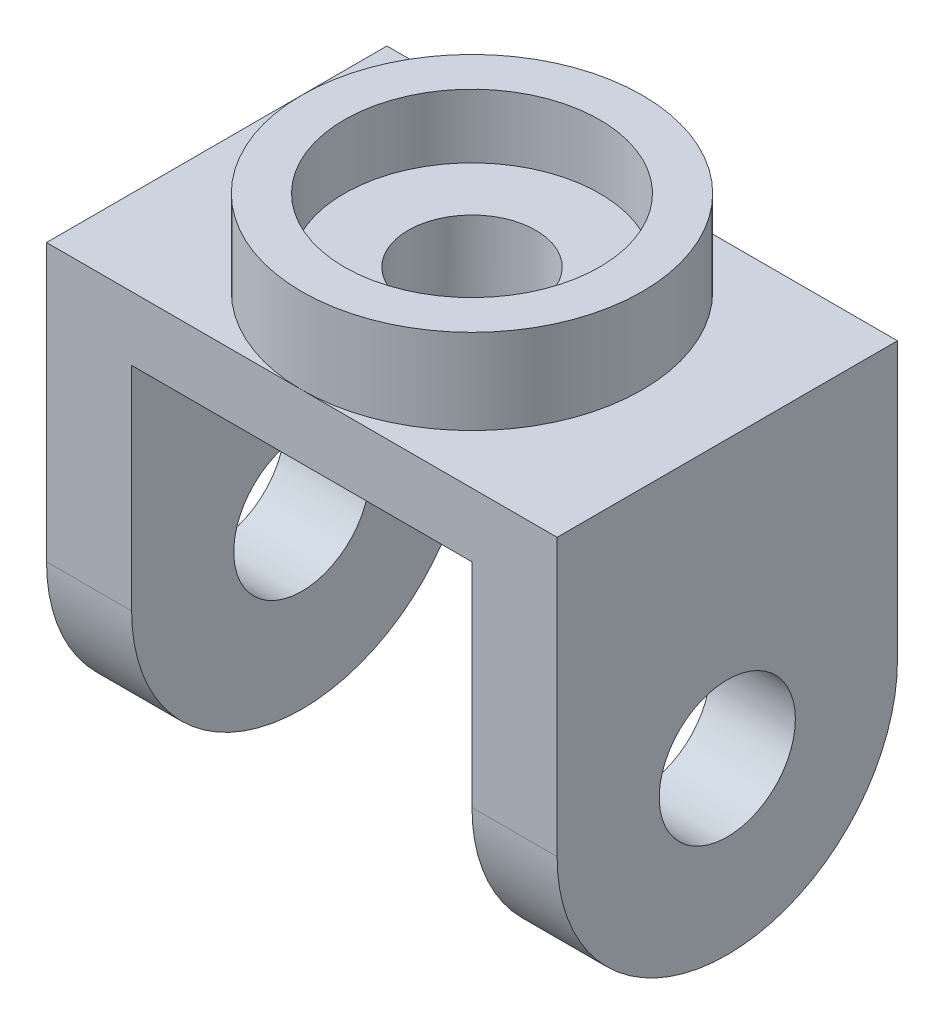
ISO-10303-21;
HEADER;
FILE_DESCRIPTION(('STEP AP214'),'2;1');
FILE_NAME('part.step','',(''),(''),'','','');
FILE_SCHEMA(('AUTOMOTIVE_DESIGN { 1 0 10303 214 1 1 1 1 }'));
ENDSEC;
DATA;
#1=APPLICATION_CONTEXT('core data for automotive mechanical design processes');
#2=APPLICATION_PROTOCOL_DEFINITION('international standard','automotive_design',2000,#1);
#3=PRODUCT_CONTEXT('',#1,'mechanical');
#4=PRODUCT('Part','Part','',(#3));
#5=PRODUCT_RELATED_PRODUCT_CATEGORY('part','',(#4));
#6=PRODUCT_DEFINITION_FORMATION('','',#4);
#7=PRODUCT_DEFINITION_CONTEXT('part definition',#1,'design');
#8=PRODUCT_DEFINITION('design','',#6,#7);
#9=PRODUCT_DEFINITION_SHAPE('','',#8);
#10=(LENGTH_UNIT() NAMED_UNIT(*) SI_UNIT(.MILLI.,.METRE.));
#11=(NAMED_UNIT(*) PLANE_ANGLE_UNIT() SI_UNIT($,.RADIAN.));
#12=(NAMED_UNIT(*) SI_UNIT($,.STERADIAN.) SOLID_ANGLE_UNIT());
#13=UNCERTAINTY_MEASURE_WITH_UNIT(LENGTH_MEASURE(1.E-05),#10,'distance_accuracy_value','');
#14=(GEOMETRIC_REPRESENTATION_CONTEXT(3) GLOBAL_UNCERTAINTY_ASSIGNED_CONTEXT((#13)) GLOBAL_UNIT_ASSIGNED_CONTEXT((#10,
#11,#12)) REPRESENTATION_CONTEXT('',''));
#15=CARTESIAN_POINT('',(0.,0.,0.));
#16=DIRECTION('',(0.,0.,1.));
#17=DIRECTION('',(1.,0.,0.));
#18=AXIS2_PLACEMENT_3D('',#15,#16,#17);
#19=CARTESIAN_POINT('',(0.,0.,0.));
#20=DIRECTION('',(0.,-1.,0.));
#21=DIRECTION('',(0.,0.,-1.));
#22=AXIS2_PLACEMENT_3D('',#19,#20,#21);
#23=PLANE('',#22);
#24=CARTESIAN_POINT('',(0.,0.,0.));
#25=DIRECTION('',(0.,-1.,0.));
#26=DIRECTION('',(0.,0.,-1.));
#27=AXIS2_PLACEMENT_3D('',#24,#25,#26);
#28=CIRCLE('',#27,15.);
#29=CARTESIAN_POINT('',(0.,0.,-15.));
#30=VERTEX_POINT('',#29);
#31=EDGE_CURVE('E47',#30,#30,#28,.T.);
#32=ORIENTED_EDGE('',*,*,#31,.F.);
#33=EDGE_LOOP('',(#32));
#34=FACE_BOUND('',#33,.T.);
#35=DIRECTION('',(1.,0.,0.));
#36=VECTOR('',#35,1.);
#37=CARTESIAN_POINT('',(-60.,0.,40.));
#38=LINE('',#37,#36);
#39=CARTESIAN_POINT('',(-40.,0.,40.));
#40=VERTEX_POINT('',#39);
#41=CARTESIAN_POINT('',(40.,0.,40.));
#42=VERTEX_POINT('',#41);
#43=EDGE_CURVE('E62',#40,#42,#38,.T.);
#44=ORIENTED_EDGE('',*,*,#43,.F.);
#45=DIRECTION('',(0.,0.,-1.));
#46=VECTOR('',#45,1.);
#47=CARTESIAN_POINT('',(-40.,0.,40.));
#48=LINE('',#47,#46);
#49=CARTESIAN_POINT('',(-40.,0.,-40.));
#50=VERTEX_POINT('',#49);
#51=EDGE_CURVE('E125',#40,#50,#48,.T.);
#52=ORIENTED_EDGE('',*,*,#51,.T.);
#53=DIRECTION('',(1.,0.,0.));
#54=VECTOR('',#53,1.);
#55=CARTESIAN_POINT('',(-60.,0.,-40.));
#56=LINE('',#55,#54);
#57=CARTESIAN_POINT('',(40.,0.,-40.));
#58=VERTEX_POINT('',#57);
#59=EDGE_CURVE('E141',#50,#58,#56,.T.);
#60=ORIENTED_EDGE('',*,*,#59,.T.);
#61=DIRECTION('',(0.,0.,-1.));
#62=VECTOR('',#61,1.);
#63=CARTESIAN_POINT('',(40.,0.,40.));
#64=LINE('',#63,#62);
#65=EDGE_CURVE('E137',#42,#58,#64,.T.);
#66=ORIENTED_EDGE('',*,*,#65,.F.);
#67=EDGE_LOOP('',(#44,#52,#60,#66));
#68=FACE_BOUND('',#67,.T.);
#69=ADVANCED_FACE('F43',(#34,#68),#23,.T.);
#70=CARTESIAN_POINT('',(0.,15.,0.));
#71=DIRECTION('',(0.,-1.,0.));
#72=DIRECTION('',(0.,0.,-1.));
#73=AXIS2_PLACEMENT_3D('',#70,#71,#72);
#74=PLANE('',#73);
#75=CARTESIAN_POINT('',(0.,15.,0.));
#76=DIRECTION('',(0.,1.,0.));
#77=DIRECTION('',(0.,0.,1.));
#78=AXIS2_PLACEMENT_3D('',#75,#76,#77);
#79=CIRCLE('',#78,40.);
#80=CARTESIAN_POINT('',(0.,15.,40.));
#81=VERTEX_POINT('',#80);
#82=CARTESIAN_POINT('',(0.,15.,-40.));
#83=VERTEX_POINT('',#82);
#84=EDGE_CURVE('E55',#81,#83,#79,.T.);
#85=ORIENTED_EDGE('',*,*,#84,.F.);
#86=DIRECTION('',(1.,0.,0.));
#87=VECTOR('',#86,1.);
#88=CARTESIAN_POINT('',(-60.,15.,40.));
#89=LINE('',#88,#87);
#90=CARTESIAN_POINT('',(60.,15.,40.));
#91=VERTEX_POINT('',#90);
#92=EDGE_CURVE('E170',#81,#91,#89,.T.);
#93=ORIENTED_EDGE('',*,*,#92,.T.);
#94=DIRECTION('',(0.,0.,1.));
#95=VECTOR('',#94,1.);
#96=CARTESIAN_POINT('',(60.,15.,-40.));
#97=LINE('',#96,#95);
#98=CARTESIAN_POINT('',(60.,15.,-40.));
#99=VERTEX_POINT('',#98);
#100=EDGE_CURVE('E173',#99,#91,#97,.T.);
#101=ORIENTED_EDGE('',*,*,#100,.F.);
#102=DIRECTION('',(1.,0.,0.));
#103=VECTOR('',#102,1.);
#104=CARTESIAN_POINT('',(-60.,15.,-40.));
#105=LINE('',#104,#103);
#106=EDGE_CURVE('E140',#83,#99,#105,.T.);
#107=ORIENTED_EDGE('',*,*,#106,.F.);
#108=EDGE_LOOP('',(#85,#93,#101,#107));
#109=FACE_BOUND('',#108,.T.);
#110=ADVANCED_FACE('F264',(#109),#74,.F.);
#111=CARTESIAN_POINT('',(-60.,15.,-40.));
#112=DIRECTION('',(0.,0.,-1.));
#113=DIRECTION('',(-1.,0.,0.));
#114=AXIS2_PLACEMENT_3D('',#111,#112,#113);
#115=PLANE('',#114);
#116=ORIENTED_EDGE('',*,*,#59,.F.);
#117=DIRECTION('',(0.,-1.,0.));
#118=VECTOR('',#117,1.);
#119=CARTESIAN_POINT('',(-40.,0.,-40.));
#120=LINE('',#119,#118);
#121=CARTESIAN_POINT('',(-40.,-50.,-40.));
#122=VERTEX_POINT('',#121);
#123=EDGE_CURVE('E130',#50,#122,#120,.T.);
#124=ORIENTED_EDGE('',*,*,#123,.T.);
#125=DIRECTION('',(-1.,0.,0.));
#126=VECTOR('',#125,1.);
#127=CARTESIAN_POINT('',(-40.,-50.,-40.));
#128=LINE('',#127,#126);
#129=CARTESIAN_POINT('',(-60.,-50.,-40.));
#130=VERTEX_POINT('',#129);
#131=EDGE_CURVE('E229',#122,#130,#128,.T.);
#132=ORIENTED_EDGE('',*,*,#131,.T.);
#133=DIRECTION('',(0.,-1.,0.));
#134=VECTOR('',#133,1.);
#135=CARTESIAN_POINT('',(-60.,15.,-40.));
#136=LINE('',#135,#134);
#137=CARTESIAN_POINT('',(-60.,15.,-40.));
#138=VERTEX_POINT('',#137);
#139=EDGE_CURVE('E53',#138,#130,#136,.T.);
#140=ORIENTED_EDGE('',*,*,#139,.F.);
#141=EDGE_CURVE('E145',#138,#83,#105,.T.);
#142=ORIENTED_EDGE('',*,*,#141,.T.);
#143=ORIENTED_EDGE('',*,*,#106,.T.);
#144=DIRECTION('',(0.,-1.,0.));
#145=VECTOR('',#144,1.);
#146=CARTESIAN_POINT('',(60.,15.,-40.));
#147=LINE('',#146,#145);
#148=CARTESIAN_POINT('',(60.,-50.,-40.));
#149=VERTEX_POINT('',#148);
#150=EDGE_CURVE('E158',#99,#149,#147,.T.);
#151=ORIENTED_EDGE('',*,*,#150,.T.);
#152=DIRECTION('',(1.,0.,0.));
#153=VECTOR('',#152,1.);
#154=CARTESIAN_POINT('',(40.,-50.,-40.));
#155=LINE('',#154,#153);
#156=CARTESIAN_POINT('',(40.,-50.,-40.));
#157=VERTEX_POINT('',#156);
#158=EDGE_CURVE('E196',#157,#149,#155,.T.);
#159=ORIENTED_EDGE('',*,*,#158,.F.);
#160=DIRECTION('',(0.,-1.,0.));
#161=VECTOR('',#160,1.);
#162=CARTESIAN_POINT('',(40.,0.,-40.));
#163=LINE('',#162,#161);
#164=EDGE_CURVE('E215',#58,#157,#163,.T.);
#165=ORIENTED_EDGE('',*,*,#164,.F.);
#166=EDGE_LOOP('',(#116,#124,#132,#140,#142,#143,#151,#159,#165));
#167=FACE_BOUND('',#166,.T.);
#168=ADVANCED_FACE('F45',(#167),#115,.T.);
#169=CARTESIAN_POINT('',(-60.,15.,-40.));
#170=DIRECTION('',(1.,0.,0.));
#171=DIRECTION('',(0.,0.,-1.));
#172=AXIS2_PLACEMENT_3D('',#169,#170,#171);
#173=PLANE('',#172);
#174=CARTESIAN_POINT('',(-60.,-50.,0.));
#175=DIRECTION('',(1.,0.,0.));
#176=DIRECTION('',(0.,0.,-1.));
#177=AXIS2_PLACEMENT_3D('',#174,#175,#176);
#178=CIRCLE('',#177,16.);
#179=CARTESIAN_POINT('',(-60.,-50.,-16.));
#180=VERTEX_POINT('',#179);
#181=EDGE_CURVE('E241',#180,#180,#178,.T.);
#182=ORIENTED_EDGE('',*,*,#181,.T.);
#183=EDGE_LOOP('',(#182));
#184=FACE_BOUND('',#183,.T.);
#185=ORIENTED_EDGE('',*,*,#139,.T.);
#186=CARTESIAN_POINT('',(-60.,-50.,0.));
#187=DIRECTION('',(1.,0.,0.));
#188=DIRECTION('',(0.,0.,-1.));
#189=AXIS2_PLACEMENT_3D('',#186,#187,#188);
#190=CIRCLE('',#189,40.);
#191=CARTESIAN_POINT('',(-60.,-50.,40.));
#192=VERTEX_POINT('',#191);
#193=EDGE_CURVE('E134',#192,#130,#190,.T.);
#194=ORIENTED_EDGE('',*,*,#193,.F.);
#195=DIRECTION('',(0.,-1.,0.));
#196=VECTOR('',#195,1.);
#197=CARTESIAN_POINT('',(-60.,15.,40.));
#198=LINE('',#197,#196);
#199=CARTESIAN_POINT('',(-60.,15.,40.));
#200=VERTEX_POINT('',#199);
#201=EDGE_CURVE('E153',#200,#192,#198,.T.);
#202=ORIENTED_EDGE('',*,*,#201,.F.);
#203=DIRECTION('',(0.,0.,1.));
#204=VECTOR('',#203,1.);
#205=CARTESIAN_POINT('',(-60.,15.,-40.));
#206=LINE('',#205,#204);
#207=EDGE_CURVE('E160',#138,#200,#206,.T.);
#208=ORIENTED_EDGE('',*,*,#207,.F.);
#209=EDGE_LOOP('',(#185,#194,#202,#208));
#210=FACE_BOUND('',#209,.T.);
#211=ADVANCED_FACE('F276',(#184,#210),#173,.F.);
#212=CARTESIAN_POINT('',(-60.,15.,40.));
#213=DIRECTION('',(0.,0.,-1.));
#214=DIRECTION('',(-1.,0.,0.));
#215=AXIS2_PLACEMENT_3D('',#212,#213,#214);
#216=PLANE('',#215);
#217=ORIENTED_EDGE('',*,*,#201,.T.);
#218=DIRECTION('',(-1.,0.,0.));
#219=VECTOR('',#218,1.);
#220=CARTESIAN_POINT('',(-40.,-50.,40.));
#221=LINE('',#220,#219);
#222=CARTESIAN_POINT('',(-40.,-50.,40.));
#223=VERTEX_POINT('',#222);
#224=EDGE_CURVE('E120',#223,#192,#221,.T.);
#225=ORIENTED_EDGE('',*,*,#224,.F.);
#226=DIRECTION('',(0.,-1.,0.));
#227=VECTOR('',#226,1.);
#228=CARTESIAN_POINT('',(-40.,0.,40.));
#229=LINE('',#228,#227);
#230=EDGE_CURVE('E116',#40,#223,#229,.T.);
#231=ORIENTED_EDGE('',*,*,#230,.F.);
#232=ORIENTED_EDGE('',*,*,#43,.T.);
#233=DIRECTION('',(0.,-1.,0.));
#234=VECTOR('',#233,1.);
#235=CARTESIAN_POINT('',(40.,0.,40.));
#236=LINE('',#235,#234);
#237=CARTESIAN_POINT('',(40.,-50.,40.));
#238=VERTEX_POINT('',#237);
#239=EDGE_CURVE('E203',#42,#238,#236,.T.);
#240=ORIENTED_EDGE('',*,*,#239,.T.);
#241=DIRECTION('',(1.,0.,0.));
#242=VECTOR('',#241,1.);
#243=CARTESIAN_POINT('',(40.,-50.,40.));
#244=LINE('',#243,#242);
#245=CARTESIAN_POINT('',(60.,-50.,40.));
#246=VERTEX_POINT('',#245);
#247=EDGE_CURVE('E199',#238,#246,#244,.T.);
#248=ORIENTED_EDGE('',*,*,#247,.T.);
#249=DIRECTION('',(0.,-1.,0.));
#250=VECTOR('',#249,1.);
#251=CARTESIAN_POINT('',(60.,15.,40.));
#252=LINE('',#251,#250);
#253=EDGE_CURVE('E156',#91,#246,#252,.T.);
#254=ORIENTED_EDGE('',*,*,#253,.F.);
#255=ORIENTED_EDGE('',*,*,#92,.F.);
#256=EDGE_CURVE('E166',#200,#81,#89,.T.);
#257=ORIENTED_EDGE('',*,*,#256,.F.);
#258=EDGE_LOOP('',(#217,#225,#231,#232,#240,#248,#254,#255,#257));
#259=FACE_BOUND('',#258,.T.);
#260=ADVANCED_FACE('F118',(#259),#216,.F.);
#261=CARTESIAN_POINT('',(60.,15.,-40.));
#262=DIRECTION('',(1.,0.,0.));
#263=DIRECTION('',(0.,0.,-1.));
#264=AXIS2_PLACEMENT_3D('',#261,#262,#263);
#265=PLANE('',#264);
#266=CARTESIAN_POINT('',(60.,-50.,0.));
#267=DIRECTION('',(1.,0.,0.));
#268=DIRECTION('',(0.,0.,-1.));
#269=AXIS2_PLACEMENT_3D('',#266,#267,#268);
#270=CIRCLE('',#269,16.);
#271=CARTESIAN_POINT('',(60.,-50.,-16.));
#272=VERTEX_POINT('',#271);
#273=EDGE_CURVE('E220',#272,#272,#270,.T.);
#274=ORIENTED_EDGE('',*,*,#273,.F.);
#275=EDGE_LOOP('',(#274));
#276=FACE_BOUND('',#275,.T.);
#277=ORIENTED_EDGE('',*,*,#253,.T.);
#278=CARTESIAN_POINT('',(60.,-50.,0.));
#279=DIRECTION('',(1.,0.,0.));
#280=DIRECTION('',(0.,0.,-1.));
#281=AXIS2_PLACEMENT_3D('',#278,#279,#280);
#282=CIRCLE('',#281,40.);
#283=EDGE_CURVE('E204',#246,#149,#282,.T.);
#284=ORIENTED_EDGE('',*,*,#283,.T.);
#285=ORIENTED_EDGE('',*,*,#150,.F.);
#286=ORIENTED_EDGE('',*,*,#100,.T.);
#287=EDGE_LOOP('',(#277,#284,#285,#286));
#288=FACE_BOUND('',#287,.T.);
#289=ADVANCED_FACE('F281',(#276,#288),#265,.T.);
#290=EDGE_CURVE('E11',#83,#81,#79,.T.);
#291=ORIENTED_EDGE('',*,*,#290,.F.);
#292=ORIENTED_EDGE('',*,*,#141,.F.);
#293=ORIENTED_EDGE('',*,*,#207,.T.);
#294=ORIENTED_EDGE('',*,*,#256,.T.);
#295=EDGE_LOOP('',(#291,#292,#293,#294));
#296=FACE_BOUND('',#295,.T.);
#297=ADVANCED_FACE('F272',(#296),#74,.F.);
#298=CARTESIAN_POINT('',(0.,35.,0.));
#299=DIRECTION('',(0.,-1.,0.));
#300=DIRECTION('',(0.,0.,-1.));
#301=AXIS2_PLACEMENT_3D('',#298,#299,#300);
#302=CYLINDRICAL_SURFACE('',#301,40.);
#303=CARTESIAN_POINT('',(0.,35.,0.));
#304=DIRECTION('',(0.,1.,0.));
#305=DIRECTION('',(0.,0.,1.));
#306=AXIS2_PLACEMENT_3D('',#303,#304,#305);
#307=CIRCLE('',#306,40.);
#308=CARTESIAN_POINT('',(0.,35.,40.));
#309=VERTEX_POINT('',#308);
#310=EDGE_CURVE('E147',#309,#309,#307,.T.);
#311=ORIENTED_EDGE('',*,*,#310,.F.);
#312=EDGE_LOOP('',(#311));
#313=FACE_BOUND('',#312,.T.);
#314=ORIENTED_EDGE('',*,*,#84,.T.);
#315=ORIENTED_EDGE('',*,*,#290,.T.);
#316=EDGE_LOOP('',(#314,#315));
#317=FACE_BOUND('',#316,.T.);
#318=ADVANCED_FACE('F287',(#313,#317),#302,.T.);
#319=CARTESIAN_POINT('',(0.,35.,0.));
#320=DIRECTION('',(0.,1.,0.));
#321=DIRECTION('',(0.,0.,1.));
#322=AXIS2_PLACEMENT_3D('',#319,#320,#321);
#323=PLANE('',#322);
#324=CARTESIAN_POINT('',(0.,35.,0.));
#325=DIRECTION('',(0.,1.,0.));
#326=DIRECTION('',(0.,0.,1.));
#327=AXIS2_PLACEMENT_3D('',#324,#325,#326);
#328=CIRCLE('',#327,30.);
#329=CARTESIAN_POINT('',(0.,35.,30.));
#330=VERTEX_POINT('',#329);
#331=EDGE_CURVE('E185',#330,#330,#328,.T.);
#332=ORIENTED_EDGE('',*,*,#331,.F.);
#333=EDGE_LOOP('',(#332));
#334=FACE_BOUND('',#333,.T.);
#335=ORIENTED_EDGE('',*,*,#310,.T.);
#336=EDGE_LOOP('',(#335));
#337=FACE_BOUND('',#336,.T.);
#338=ADVANCED_FACE('F322',(#334,#337),#323,.T.);
#339=CARTESIAN_POINT('',(0.,20.,0.));
#340=DIRECTION('',(0.,1.,0.));
#341=DIRECTION('',(0.,0.,1.));
#342=AXIS2_PLACEMENT_3D('',#339,#340,#341);
#343=CYLINDRICAL_SURFACE('',#342,30.);
#344=CARTESIAN_POINT('',(0.,20.,0.));
#345=DIRECTION('',(0.,1.,0.));
#346=DIRECTION('',(0.,0.,1.));
#347=AXIS2_PLACEMENT_3D('',#344,#345,#346);
#348=CIRCLE('',#347,30.);
#349=CARTESIAN_POINT('',(0.,20.,30.));
#350=VERTEX_POINT('',#349);
#351=EDGE_CURVE('E181',#350,#350,#348,.T.);
#352=ORIENTED_EDGE('',*,*,#351,.F.);
#353=EDGE_LOOP('',(#352));
#354=FACE_BOUND('',#353,.T.);
#355=ORIENTED_EDGE('',*,*,#331,.T.);
#356=EDGE_LOOP('',(#355));
#357=FACE_BOUND('',#356,.T.);
#358=ADVANCED_FACE('F318',(#354,#357),#343,.F.);
#359=CARTESIAN_POINT('',(0.,20.,0.));
#360=DIRECTION('',(0.,1.,0.));
#361=DIRECTION('',(0.,0.,1.));
#362=AXIS2_PLACEMENT_3D('',#359,#360,#361);
#363=PLANE('',#362);
#364=CARTESIAN_POINT('',(0.,20.,0.));
#365=DIRECTION('',(0.,1.,0.));
#366=DIRECTION('',(0.,0.,1.));
#367=AXIS2_PLACEMENT_3D('',#364,#365,#366);
#368=CIRCLE('',#367,15.);
#369=CARTESIAN_POINT('',(0.,20.,15.));
#370=VERTEX_POINT('',#369);
#371=EDGE_CURVE('E192',#370,#370,#368,.T.);
#372=ORIENTED_EDGE('',*,*,#371,.F.);
#373=EDGE_LOOP('',(#372));
#374=FACE_BOUND('',#373,.T.);
#375=ORIENTED_EDGE('',*,*,#351,.T.);
#376=EDGE_LOOP('',(#375));
#377=FACE_BOUND('',#376,.T.);
#378=ADVANCED_FACE('F314',(#374,#377),#363,.T.);
#379=CARTESIAN_POINT('',(0.,-8.99999999999999,0.));
#380=DIRECTION('',(0.,1.,0.));
#381=DIRECTION('',(0.,0.,1.));
#382=AXIS2_PLACEMENT_3D('',#379,#380,#381);
#383=CYLINDRICAL_SURFACE('',#382,15.);
#384=ORIENTED_EDGE('',*,*,#31,.T.);
#385=EDGE_LOOP('',(#384));
#386=FACE_BOUND('',#385,.T.);
#387=ORIENTED_EDGE('',*,*,#371,.T.);
#388=EDGE_LOOP('',(#387));
#389=FACE_BOUND('',#388,.T.);
#390=ADVANCED_FACE('F309',(#386,#389),#383,.F.);
#391=CARTESIAN_POINT('',(40.,-50.,0.));
#392=DIRECTION('',(1.,0.,0.));
#393=DIRECTION('',(0.,0.,-1.));
#394=AXIS2_PLACEMENT_3D('',#391,#392,#393);
#395=CYLINDRICAL_SURFACE('',#394,40.);
#396=ORIENTED_EDGE('',*,*,#283,.F.);
#397=ORIENTED_EDGE('',*,*,#247,.F.);
#398=CARTESIAN_POINT('',(40.,-50.,0.));
#399=DIRECTION('',(1.,0.,0.));
#400=DIRECTION('',(0.,0.,-1.));
#401=AXIS2_PLACEMENT_3D('',#398,#399,#400);
#402=CIRCLE('',#401,40.);
#403=EDGE_CURVE('E211',#238,#157,#402,.T.);
#404=ORIENTED_EDGE('',*,*,#403,.T.);
#405=ORIENTED_EDGE('',*,*,#158,.T.);
#406=EDGE_LOOP('',(#396,#397,#404,#405));
#407=FACE_BOUND('',#406,.T.);
#408=ADVANCED_FACE('F296',(#407),#395,.T.);
#409=CARTESIAN_POINT('',(40.,-50.,0.));
#410=DIRECTION('',(1.,0.,0.));
#411=DIRECTION('',(0.,0.,-1.));
#412=AXIS2_PLACEMENT_3D('',#409,#410,#411);
#413=PLANE('',#412);
#414=CARTESIAN_POINT('',(40.,-50.,0.));
#415=DIRECTION('',(1.,0.,0.));
#416=DIRECTION('',(0.,0.,-1.));
#417=AXIS2_PLACEMENT_3D('',#414,#415,#416);
#418=CIRCLE('',#417,16.);
#419=CARTESIAN_POINT('',(40.,-50.,-16.));
#420=VERTEX_POINT('',#419);
#421=EDGE_CURVE('E208',#420,#420,#418,.T.);
#422=ORIENTED_EDGE('',*,*,#421,.T.);
#423=EDGE_LOOP('',(#422));
#424=FACE_BOUND('',#423,.T.);
#425=ORIENTED_EDGE('',*,*,#65,.T.);
#426=ORIENTED_EDGE('',*,*,#164,.T.);
#427=ORIENTED_EDGE('',*,*,#403,.F.);
#428=ORIENTED_EDGE('',*,*,#239,.F.);
#429=EDGE_LOOP('',(#425,#426,#427,#428));
#430=FACE_BOUND('',#429,.T.);
#431=ADVANCED_FACE('F299',(#424,#430),#413,.F.);
#432=CARTESIAN_POINT('',(40.,-50.,0.));
#433=DIRECTION('',(1.,0.,0.));
#434=DIRECTION('',(0.,0.,-1.));
#435=AXIS2_PLACEMENT_3D('',#432,#433,#434);
#436=CYLINDRICAL_SURFACE('',#435,16.);
#437=ORIENTED_EDGE('',*,*,#421,.F.);
#438=EDGE_LOOP('',(#437));
#439=FACE_BOUND('',#438,.T.);
#440=ORIENTED_EDGE('',*,*,#273,.T.);
#441=EDGE_LOOP('',(#440));
#442=FACE_BOUND('',#441,.T.);
#443=ADVANCED_FACE('F260',(#439,#442),#436,.F.);
#444=CARTESIAN_POINT('',(-40.,-50.,0.));
#445=DIRECTION('',(-1.,0.,0.));
#446=DIRECTION('',(0.,0.,1.));
#447=AXIS2_PLACEMENT_3D('',#444,#445,#446);
#448=CYLINDRICAL_SURFACE('',#447,40.);
#449=ORIENTED_EDGE('',*,*,#193,.T.);
#450=ORIENTED_EDGE('',*,*,#131,.F.);
#451=CARTESIAN_POINT('',(-40.,-50.,0.));
#452=DIRECTION('',(1.,0.,0.));
#453=DIRECTION('',(0.,0.,-1.));
#454=AXIS2_PLACEMENT_3D('',#451,#452,#453);
#455=CIRCLE('',#454,40.);
#456=EDGE_CURVE('E124',#223,#122,#455,.T.);
#457=ORIENTED_EDGE('',*,*,#456,.F.);
#458=ORIENTED_EDGE('',*,*,#224,.T.);
#459=EDGE_LOOP('',(#449,#450,#457,#458));
#460=FACE_BOUND('',#459,.T.);
#461=ADVANCED_FACE('F253',(#460),#448,.T.);
#462=CARTESIAN_POINT('',(-40.,-50.,0.));
#463=DIRECTION('',(-1.,0.,0.));
#464=DIRECTION('',(0.,0.,-1.));
#465=AXIS2_PLACEMENT_3D('',#462,#463,#464);
#466=PLANE('',#465);
#467=CARTESIAN_POINT('',(-40.,-50.,0.));
#468=DIRECTION('',(1.,0.,0.));
#469=DIRECTION('',(0.,0.,-1.));
#470=AXIS2_PLACEMENT_3D('',#467,#468,#469);
#471=CIRCLE('',#470,16.);
#472=CARTESIAN_POINT('',(-40.,-50.,-16.));
#473=VERTEX_POINT('',#472);
#474=EDGE_CURVE('E236',#473,#473,#471,.T.);
#475=ORIENTED_EDGE('',*,*,#474,.F.);
#476=EDGE_LOOP('',(#475));
#477=FACE_BOUND('',#476,.T.);
#478=ORIENTED_EDGE('',*,*,#51,.F.);
#479=ORIENTED_EDGE('',*,*,#230,.T.);
#480=ORIENTED_EDGE('',*,*,#456,.T.);
#481=ORIENTED_EDGE('',*,*,#123,.F.);
#482=EDGE_LOOP('',(#478,#479,#480,#481));
#483=FACE_BOUND('',#482,.T.);
#484=ADVANCED_FACE('F128',(#477,#483),#466,.F.);
#485=CARTESIAN_POINT('',(-40.,-50.,0.));
#486=DIRECTION('',(-1.,0.,0.));
#487=DIRECTION('',(0.,0.,1.));
#488=AXIS2_PLACEMENT_3D('',#485,#486,#487);
#489=CYLINDRICAL_SURFACE('',#488,16.);
#490=ORIENTED_EDGE('',*,*,#474,.T.);
#491=EDGE_LOOP('',(#490));
#492=FACE_BOUND('',#491,.T.);
#493=ORIENTED_EDGE('',*,*,#181,.F.);
#494=EDGE_LOOP('',(#493));
#495=FACE_BOUND('',#494,.T.);
#496=ADVANCED_FACE('F249',(#492,#495),#489,.F.);
#497=CLOSED_SHELL('',(#69,#110,#168,#211,#260,#289,#297,#318,#338,#358,#378,#390,#408,#431,#443,
#461,#484,#496));
#498=MANIFOLD_SOLID_BREP('B2',#497);
#499=ADVANCED_BREP_SHAPE_REPRESENTATION('',(#18,#498),#14);
#500=SHAPE_DEFINITION_REPRESENTATION(#9,#499);
ENDSEC;
END-ISO-10303-21;
